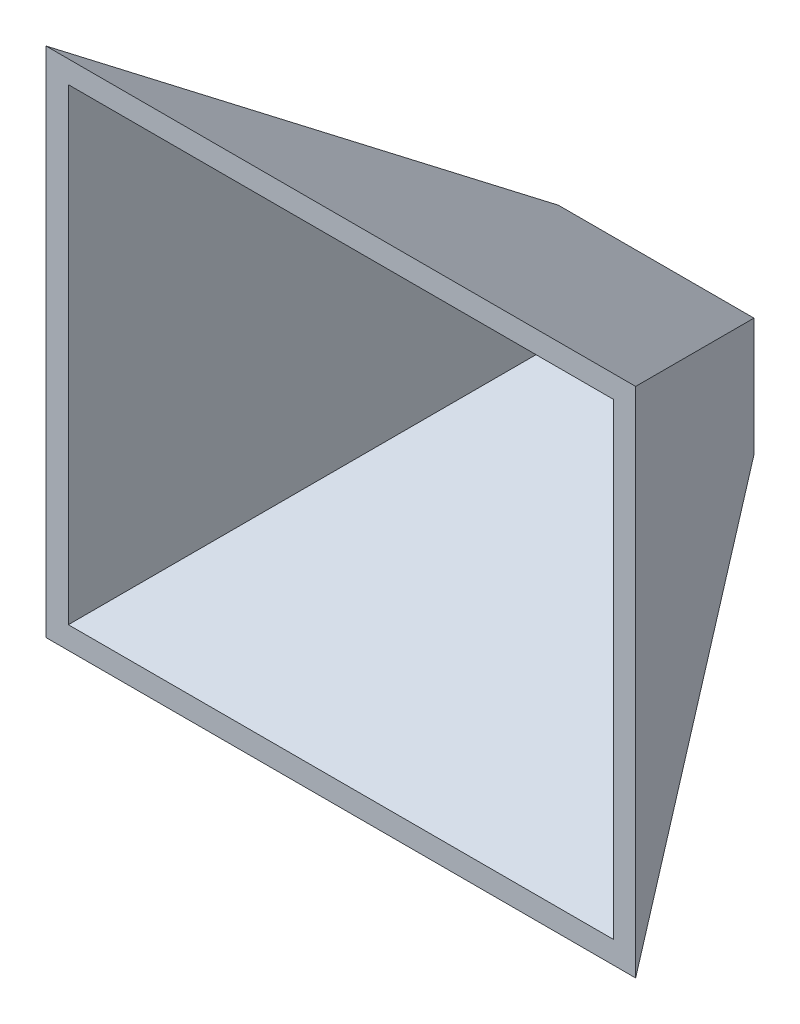
ISO-10303-21;
HEADER;
FILE_DESCRIPTION(('STEP AP214'),'2;1');
FILE_NAME('part.step','',(''),(''),'','','');
FILE_SCHEMA(('AUTOMOTIVE_DESIGN { 1 0 10303 214 1 1 1 1 }'));
ENDSEC;
DATA;
#1=APPLICATION_CONTEXT('core data for automotive mechanical design processes');
#2=APPLICATION_PROTOCOL_DEFINITION('international standard','automotive_design',2000,#1);
#3=PRODUCT_CONTEXT('',#1,'mechanical');
#4=PRODUCT('Part','Part','',(#3));
#5=PRODUCT_RELATED_PRODUCT_CATEGORY('part','',(#4));
#6=PRODUCT_DEFINITION_FORMATION('','',#4);
#7=PRODUCT_DEFINITION_CONTEXT('part definition',#1,'design');
#8=PRODUCT_DEFINITION('design','',#6,#7);
#9=PRODUCT_DEFINITION_SHAPE('','',#8);
#10=(LENGTH_UNIT() NAMED_UNIT(*) SI_UNIT(.MILLI.,.METRE.));
#11=(NAMED_UNIT(*) PLANE_ANGLE_UNIT() SI_UNIT($,.RADIAN.));
#12=(NAMED_UNIT(*) SI_UNIT($,.STERADIAN.) SOLID_ANGLE_UNIT());
#13=UNCERTAINTY_MEASURE_WITH_UNIT(LENGTH_MEASURE(1.E-05),#10,'distance_accuracy_value','');
#14=(GEOMETRIC_REPRESENTATION_CONTEXT(3) GLOBAL_UNCERTAINTY_ASSIGNED_CONTEXT((#13)) GLOBAL_UNIT_ASSIGNED_CONTEXT((#10,
#11,#12)) REPRESENTATION_CONTEXT('',''));
#15=CARTESIAN_POINT('',(0.,0.,0.));
#16=DIRECTION('',(0.,0.,1.));
#17=DIRECTION('',(1.,0.,0.));
#18=AXIS2_PLACEMENT_3D('',#15,#16,#17);
#19=CARTESIAN_POINT('',(0.,0.,0.));
#20=DIRECTION('',(0.,0.,-1.));
#21=DIRECTION('',(-1.,0.,0.));
#22=AXIS2_PLACEMENT_3D('',#19,#20,#21);
#23=PLANE('',#22);
#24=DIRECTION('',(0.,-1.,0.));
#25=VECTOR('',#24,1.);
#26=CARTESIAN_POINT('',(23.9251500765034,0.,0.));
#27=LINE('',#26,#25);
#28=CARTESIAN_POINT('',(23.9251500765034,11.6751500765034,0.));
#29=VERTEX_POINT('',#28);
#30=CARTESIAN_POINT('',(23.9251500765034,-11.6751500765034,0.));
#31=VERTEX_POINT('',#30);
#32=EDGE_CURVE('E122',#29,#31,#27,.T.);
#33=ORIENTED_EDGE('',*,*,#32,.F.);
#34=DIRECTION('',(-1.,0.,0.));
#35=VECTOR('',#34,1.);
#36=CARTESIAN_POINT('',(0.,11.6751500765034,0.));
#37=LINE('',#36,#35);
#38=CARTESIAN_POINT('',(-23.9251500765034,11.6751500765034,0.));
#39=VERTEX_POINT('',#38);
#40=EDGE_CURVE('E108',#29,#39,#37,.T.);
#41=ORIENTED_EDGE('',*,*,#40,.T.);
#42=DIRECTION('',(0.,-1.,0.));
#43=VECTOR('',#42,1.);
#44=CARTESIAN_POINT('',(-23.9251500765034,0.,0.));
#45=LINE('',#44,#43);
#46=CARTESIAN_POINT('',(-23.9251500765034,-11.6751500765034,0.));
#47=VERTEX_POINT('',#46);
#48=EDGE_CURVE('E58',#39,#47,#45,.T.);
#49=ORIENTED_EDGE('',*,*,#48,.T.);
#50=DIRECTION('',(-1.,0.,0.));
#51=VECTOR('',#50,1.);
#52=CARTESIAN_POINT('',(0.,-11.6751500765034,0.));
#53=LINE('',#52,#51);
#54=EDGE_CURVE('E130',#31,#47,#53,.T.);
#55=ORIENTED_EDGE('',*,*,#54,.F.);
#56=EDGE_LOOP('',(#33,#41,#49,#55));
#57=FACE_BOUND('',#56,.T.);
#58=DIRECTION('',(0.,-1.,0.));
#59=VECTOR('',#58,1.);
#60=CARTESIAN_POINT('',(31.,18.75,0.));
#61=LINE('',#60,#59);
#62=CARTESIAN_POINT('',(31.,18.75,0.));
#63=VERTEX_POINT('',#62);
#64=CARTESIAN_POINT('',(31.,-18.75,0.));
#65=VERTEX_POINT('',#64);
#66=EDGE_CURVE('E191',#63,#65,#61,.T.);
#67=ORIENTED_EDGE('',*,*,#66,.T.);
#68=DIRECTION('',(-1.,0.,0.));
#69=VECTOR('',#68,1.);
#70=CARTESIAN_POINT('',(31.,-18.75,0.));
#71=LINE('',#70,#69);
#72=CARTESIAN_POINT('',(-31.,-18.75,0.));
#73=VERTEX_POINT('',#72);
#74=EDGE_CURVE('E317',#65,#73,#71,.T.);
#75=ORIENTED_EDGE('',*,*,#74,.T.);
#76=DIRECTION('',(0.,-1.,0.));
#77=VECTOR('',#76,1.);
#78=CARTESIAN_POINT('',(-31.,18.75,0.));
#79=LINE('',#78,#77);
#80=CARTESIAN_POINT('',(-31.,18.75,0.));
#81=VERTEX_POINT('',#80);
#82=EDGE_CURVE('E50',#81,#73,#79,.T.);
#83=ORIENTED_EDGE('',*,*,#82,.F.);
#84=DIRECTION('',(-1.,0.,0.));
#85=VECTOR('',#84,1.);
#86=CARTESIAN_POINT('',(31.,18.75,0.));
#87=LINE('',#86,#85);
#88=EDGE_CURVE('E12',#63,#81,#87,.T.);
#89=ORIENTED_EDGE('',*,*,#88,.F.);
#90=EDGE_LOOP('',(#67,#75,#83,#89));
#91=FACE_BOUND('',#90,.T.);
#92=ADVANCED_FACE('F40',(#57,#91),#23,.T.);
#93=CARTESIAN_POINT('',(0.,0.,100.));
#94=DIRECTION('',(0.,0.,-1.));
#95=DIRECTION('',(-1.,0.,0.));
#96=AXIS2_PLACEMENT_3D('',#93,#94,#95);
#97=PLANE('',#96);
#98=DIRECTION('',(-1.,0.,0.));
#99=VECTOR('',#98,1.);
#100=CARTESIAN_POINT('',(0.,74.1551500765033,100.));
#101=LINE('',#100,#99);
#102=CARTESIAN_POINT('',(86.4051500765034,74.1551500765034,100.));
#103=VERTEX_POINT('',#102);
#104=CARTESIAN_POINT('',(-86.4051500765034,74.1551500765033,100.));
#105=VERTEX_POINT('',#104);
#106=EDGE_CURVE('E127',#103,#105,#101,.T.);
#107=ORIENTED_EDGE('',*,*,#106,.F.);
#108=DIRECTION('',(0.,-1.,0.));
#109=VECTOR('',#108,1.);
#110=CARTESIAN_POINT('',(86.4051500765034,0.,100.));
#111=LINE('',#110,#109);
#112=CARTESIAN_POINT('',(86.4051500765034,-74.1551500765033,100.));
#113=VERTEX_POINT('',#112);
#114=EDGE_CURVE('E125',#103,#113,#111,.T.);
#115=ORIENTED_EDGE('',*,*,#114,.T.);
#116=DIRECTION('',(-1.,0.,0.));
#117=VECTOR('',#116,1.);
#118=CARTESIAN_POINT('',(0.,-74.1551500765034,100.));
#119=LINE('',#118,#117);
#120=CARTESIAN_POINT('',(-86.4051500765033,-74.1551500765034,100.));
#121=VERTEX_POINT('',#120);
#122=EDGE_CURVE('E141',#113,#121,#119,.T.);
#123=ORIENTED_EDGE('',*,*,#122,.T.);
#124=DIRECTION('',(0.,-1.,0.));
#125=VECTOR('',#124,1.);
#126=CARTESIAN_POINT('',(-86.4051500765033,0.,100.));
#127=LINE('',#126,#125);
#128=EDGE_CURVE('E139',#105,#121,#127,.T.);
#129=ORIENTED_EDGE('',*,*,#128,.F.);
#130=EDGE_LOOP('',(#107,#115,#123,#129));
#131=FACE_BOUND('',#130,.T.);
#132=DIRECTION('',(0.,-1.,0.));
#133=VECTOR('',#132,1.);
#134=CARTESIAN_POINT('',(93.48,81.23,100.));
#135=LINE('',#134,#133);
#136=CARTESIAN_POINT('',(93.48,81.23,100.));
#137=VERTEX_POINT('',#136);
#138=CARTESIAN_POINT('',(93.48,-81.23,100.));
#139=VERTEX_POINT('',#138);
#140=EDGE_CURVE('E116',#137,#139,#135,.T.);
#141=ORIENTED_EDGE('',*,*,#140,.F.);
#142=DIRECTION('',(-1.,0.,0.));
#143=VECTOR('',#142,1.);
#144=CARTESIAN_POINT('',(93.48,81.23,100.));
#145=LINE('',#144,#143);
#146=CARTESIAN_POINT('',(-93.48,81.23,100.));
#147=VERTEX_POINT('',#146);
#148=EDGE_CURVE('E150',#137,#147,#145,.T.);
#149=ORIENTED_EDGE('',*,*,#148,.T.);
#150=DIRECTION('',(0.,-1.,0.));
#151=VECTOR('',#150,1.);
#152=CARTESIAN_POINT('',(-93.48,81.23,100.));
#153=LINE('',#152,#151);
#154=CARTESIAN_POINT('',(-93.48,-81.23,100.));
#155=VERTEX_POINT('',#154);
#156=EDGE_CURVE('E245',#147,#155,#153,.T.);
#157=ORIENTED_EDGE('',*,*,#156,.T.);
#158=DIRECTION('',(-1.,0.,0.));
#159=VECTOR('',#158,1.);
#160=CARTESIAN_POINT('',(93.48,-81.23,100.));
#161=LINE('',#160,#159);
#162=EDGE_CURVE('E230',#139,#155,#161,.T.);
#163=ORIENTED_EDGE('',*,*,#162,.F.);
#164=EDGE_LOOP('',(#141,#149,#157,#163));
#165=FACE_BOUND('',#164,.T.);
#166=ADVANCED_FACE('F169',(#131,#165),#97,.F.);
#167=CARTESIAN_POINT('',(0.,13.4855700516603,-8.42578416827735));
#168=DIRECTION('',(0.,0.84807452665153,-0.529876964251876));
#169=DIRECTION('',(0.,0.529876964251876,0.84807452665153));
#170=AXIS2_PLACEMENT_3D('',#167,#168,#169);
#171=PLANE('',#170);
#172=DIRECTION('',(-0.468208759667607,-0.468208759667607,-0.749373815089));
#173=VECTOR('',#172,1.);
#174=CARTESIAN_POINT('',(93.48,81.23,100.));
#175=LINE('',#174,#173);
#176=EDGE_CURVE('E156',#137,#63,#175,.T.);
#177=ORIENTED_EDGE('',*,*,#176,.T.);
#178=ORIENTED_EDGE('',*,*,#88,.T.);
#179=DIRECTION('',(0.468208759667607,-0.468208759667607,-0.749373815089));
#180=VECTOR('',#179,1.);
#181=CARTESIAN_POINT('',(-93.48,81.23,100.));
#182=LINE('',#181,#180);
#183=EDGE_CURVE('E222',#147,#81,#182,.T.);
#184=ORIENTED_EDGE('',*,*,#183,.F.);
#185=ORIENTED_EDGE('',*,*,#148,.F.);
#186=EDGE_LOOP('',(#177,#178,#184,#185));
#187=FACE_BOUND('',#186,.T.);
#188=ADVANCED_FACE('F158',(#187),#171,.T.);
#189=CARTESIAN_POINT('',(-22.2961424854117,0.,-13.9306298248852));
#190=DIRECTION('',(-0.84807452665153,0.,-0.529876964251875));
#191=DIRECTION('',(-0.529876964251876,0.,0.84807452665153));
#192=AXIS2_PLACEMENT_3D('',#189,#190,#191);
#193=PLANE('',#192);
#194=ORIENTED_EDGE('',*,*,#183,.T.);
#195=ORIENTED_EDGE('',*,*,#82,.T.);
#196=DIRECTION('',(0.468208759667607,0.468208759667607,-0.749373815089));
#197=VECTOR('',#196,1.);
#198=CARTESIAN_POINT('',(-93.48,-81.23,100.));
#199=LINE('',#198,#197);
#200=EDGE_CURVE('E221',#155,#73,#199,.T.);
#201=ORIENTED_EDGE('',*,*,#200,.F.);
#202=ORIENTED_EDGE('',*,*,#156,.F.);
#203=EDGE_LOOP('',(#194,#195,#201,#202));
#204=FACE_BOUND('',#203,.T.);
#205=ADVANCED_FACE('F168',(#204),#193,.T.);
#206=CARTESIAN_POINT('',(22.2961424854117,0.,-13.9306298248852));
#207=DIRECTION('',(-0.84807452665153,0.,0.529876964251876));
#208=DIRECTION('',(0.529876964251876,0.,0.84807452665153));
#209=AXIS2_PLACEMENT_3D('',#206,#207,#208);
#210=PLANE('',#209);
#211=DIRECTION('',(-0.468208759667607,0.468208759667607,-0.749373815089));
#212=VECTOR('',#211,1.);
#213=CARTESIAN_POINT('',(93.48,-81.23,100.));
#214=LINE('',#213,#212);
#215=EDGE_CURVE('E214',#139,#65,#214,.T.);
#216=ORIENTED_EDGE('',*,*,#215,.T.);
#217=ORIENTED_EDGE('',*,*,#66,.F.);
#218=ORIENTED_EDGE('',*,*,#176,.F.);
#219=ORIENTED_EDGE('',*,*,#140,.T.);
#220=EDGE_LOOP('',(#216,#217,#218,#219));
#221=FACE_BOUND('',#220,.T.);
#222=ADVANCED_FACE('F196',(#221),#210,.F.);
#223=CARTESIAN_POINT('',(0.,-13.4855700516603,-8.42578416827736));
#224=DIRECTION('',(0.,0.84807452665153,0.529876964251876));
#225=DIRECTION('',(0.,-0.529876964251876,0.84807452665153));
#226=AXIS2_PLACEMENT_3D('',#223,#224,#225);
#227=PLANE('',#226);
#228=ORIENTED_EDGE('',*,*,#200,.T.);
#229=ORIENTED_EDGE('',*,*,#74,.F.);
#230=ORIENTED_EDGE('',*,*,#215,.F.);
#231=ORIENTED_EDGE('',*,*,#162,.T.);
#232=EDGE_LOOP('',(#228,#229,#230,#231));
#233=FACE_BOUND('',#232,.T.);
#234=ADVANCED_FACE('F204',(#233),#227,.F.);
#235=CARTESIAN_POINT('',(0.,8.39712289175113,-5.2465223827661));
#236=DIRECTION('',(0.,0.84807452665153,-0.529876964251876));
#237=DIRECTION('',(0.,0.529876964251876,0.84807452665153));
#238=AXIS2_PLACEMENT_3D('',#235,#236,#237);
#239=PLANE('',#238);
#240=DIRECTION('',(-0.468208759667607,-0.468208759667607,-0.749373815089));
#241=VECTOR('',#240,1.);
#242=CARTESIAN_POINT('',(16.1208721195191,3.87087211951909,-12.4908418005511));
#243=LINE('',#242,#241);
#244=EDGE_CURVE('E111',#103,#29,#243,.T.);
#245=ORIENTED_EDGE('',*,*,#244,.F.);
#246=ORIENTED_EDGE('',*,*,#106,.T.);
#247=DIRECTION('',(0.468208759667607,-0.468208759667607,-0.749373815089));
#248=VECTOR('',#247,1.);
#249=CARTESIAN_POINT('',(-16.1208721195191,3.87087211951909,-12.490841800551));
#250=LINE('',#249,#248);
#251=EDGE_CURVE('E113',#105,#39,#250,.T.);
#252=ORIENTED_EDGE('',*,*,#251,.T.);
#253=ORIENTED_EDGE('',*,*,#40,.F.);
#254=EDGE_LOOP('',(#245,#246,#252,#253));
#255=FACE_BOUND('',#254,.T.);
#256=ADVANCED_FACE('F110',(#255),#239,.F.);
#257=CARTESIAN_POINT('',(-17.2076953255025,0.,-10.751368039374));
#258=DIRECTION('',(-0.84807452665153,0.,-0.529876964251875));
#259=DIRECTION('',(-0.529876964251876,0.,0.84807452665153));
#260=AXIS2_PLACEMENT_3D('',#257,#258,#259);
#261=PLANE('',#260);
#262=ORIENTED_EDGE('',*,*,#251,.F.);
#263=ORIENTED_EDGE('',*,*,#128,.T.);
#264=DIRECTION('',(0.468208759667607,0.468208759667607,-0.749373815089));
#265=VECTOR('',#264,1.);
#266=CARTESIAN_POINT('',(-16.1208721195191,-3.8708721195191,-12.4908418005511));
#267=LINE('',#266,#265);
#268=EDGE_CURVE('E65',#121,#47,#267,.T.);
#269=ORIENTED_EDGE('',*,*,#268,.T.);
#270=ORIENTED_EDGE('',*,*,#48,.F.);
#271=EDGE_LOOP('',(#262,#263,#269,#270));
#272=FACE_BOUND('',#271,.T.);
#273=ADVANCED_FACE('F299',(#272),#261,.F.);
#274=CARTESIAN_POINT('',(17.2076953255025,0.,-10.751368039374));
#275=DIRECTION('',(-0.84807452665153,0.,0.529876964251876));
#276=DIRECTION('',(0.529876964251876,0.,0.84807452665153));
#277=AXIS2_PLACEMENT_3D('',#274,#275,#276);
#278=PLANE('',#277);
#279=DIRECTION('',(-0.468208759667607,0.468208759667607,-0.749373815089));
#280=VECTOR('',#279,1.);
#281=CARTESIAN_POINT('',(16.1208721195191,-3.87087211951909,-12.4908418005511));
#282=LINE('',#281,#280);
#283=EDGE_CURVE('E133',#113,#31,#282,.T.);
#284=ORIENTED_EDGE('',*,*,#283,.F.);
#285=ORIENTED_EDGE('',*,*,#114,.F.);
#286=ORIENTED_EDGE('',*,*,#244,.T.);
#287=ORIENTED_EDGE('',*,*,#32,.T.);
#288=EDGE_LOOP('',(#284,#285,#286,#287));
#289=FACE_BOUND('',#288,.T.);
#290=ADVANCED_FACE('F121',(#289),#278,.T.);
#291=CARTESIAN_POINT('',(0.,-8.39712289175113,-5.24652238276611));
#292=DIRECTION('',(0.,0.84807452665153,0.529876964251876));
#293=DIRECTION('',(0.,-0.529876964251876,0.84807452665153));
#294=AXIS2_PLACEMENT_3D('',#291,#292,#293);
#295=PLANE('',#294);
#296=ORIENTED_EDGE('',*,*,#268,.F.);
#297=ORIENTED_EDGE('',*,*,#122,.F.);
#298=ORIENTED_EDGE('',*,*,#283,.T.);
#299=ORIENTED_EDGE('',*,*,#54,.T.);
#300=EDGE_LOOP('',(#296,#297,#298,#299));
#301=FACE_BOUND('',#300,.T.);
#302=ADVANCED_FACE('F301',(#301),#295,.T.);
#303=CLOSED_SHELL('',(#92,#166,#188,#205,#222,#234,#256,#273,#290,#302));
#304=MANIFOLD_SOLID_BREP('B2',#303);
#305=ADVANCED_BREP_SHAPE_REPRESENTATION('',(#18,#304),#14);
#306=SHAPE_DEFINITION_REPRESENTATION(#9,#305);
ENDSEC;
END-ISO-10303-21;
